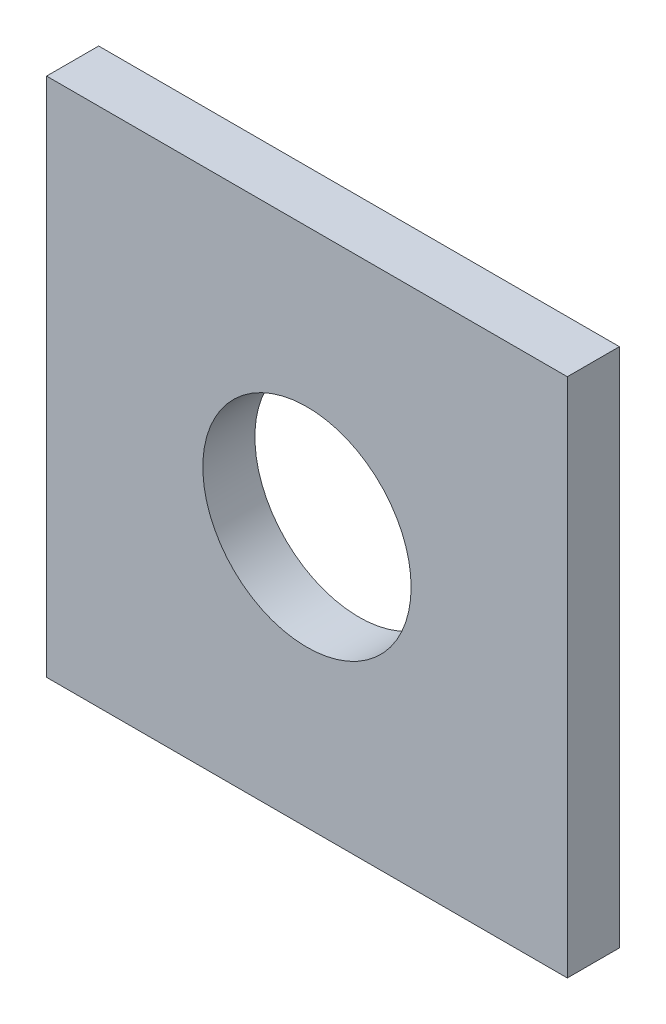
ISO-10303-21;
HEADER;
FILE_DESCRIPTION(('STEP AP214'),'2;1');
FILE_NAME('part.step','',(''),(''),'','','');
FILE_SCHEMA(('AUTOMOTIVE_DESIGN { 1 0 10303 214 1 1 1 1 }'));
ENDSEC;
DATA;
#1=APPLICATION_CONTEXT('core data for automotive mechanical design processes');
#2=APPLICATION_PROTOCOL_DEFINITION('international standard','automotive_design',2000,#1);
#3=PRODUCT_CONTEXT('',#1,'mechanical');
#4=PRODUCT('Part','Part','',(#3));
#5=PRODUCT_RELATED_PRODUCT_CATEGORY('part','',(#4));
#6=PRODUCT_DEFINITION_FORMATION('','',#4);
#7=PRODUCT_DEFINITION_CONTEXT('part definition',#1,'design');
#8=PRODUCT_DEFINITION('design','',#6,#7);
#9=PRODUCT_DEFINITION_SHAPE('','',#8);
#10=(LENGTH_UNIT() NAMED_UNIT(*) SI_UNIT(.MILLI.,.METRE.));
#11=(NAMED_UNIT(*) PLANE_ANGLE_UNIT() SI_UNIT($,.RADIAN.));
#12=(NAMED_UNIT(*) SI_UNIT($,.STERADIAN.) SOLID_ANGLE_UNIT());
#13=UNCERTAINTY_MEASURE_WITH_UNIT(LENGTH_MEASURE(1.E-05),#10,'distance_accuracy_value','');
#14=(GEOMETRIC_REPRESENTATION_CONTEXT(3) GLOBAL_UNCERTAINTY_ASSIGNED_CONTEXT((#13)) GLOBAL_UNIT_ASSIGNED_CONTEXT((#10,
#11,#12)) REPRESENTATION_CONTEXT('',''));
#15=CARTESIAN_POINT('',(0.,0.,0.));
#16=DIRECTION('',(0.,0.,1.));
#17=DIRECTION('',(1.,0.,0.));
#18=AXIS2_PLACEMENT_3D('',#15,#16,#17);
#19=CARTESIAN_POINT('',(-50.,50.,10.));
#20=DIRECTION('',(1.,0.,0.));
#21=DIRECTION('',(0.,1.,0.));
#22=AXIS2_PLACEMENT_3D('',#19,#20,#21);
#23=PLANE('',#22);
#24=DIRECTION('',(0.,-1.,0.));
#25=VECTOR('',#24,1.);
#26=CARTESIAN_POINT('',(-50.,50.,0.));
#27=LINE('',#26,#25);
#28=CARTESIAN_POINT('',(-50.,50.,0.));
#29=VERTEX_POINT('',#28);
#30=CARTESIAN_POINT('',(-50.,-50.,0.));
#31=VERTEX_POINT('',#30);
#32=EDGE_CURVE('E94',#29,#31,#27,.T.);
#33=ORIENTED_EDGE('',*,*,#32,.T.);
#34=DIRECTION('',(0.,0.,-1.));
#35=VECTOR('',#34,1.);
#36=CARTESIAN_POINT('',(-50.,-50.,10.));
#37=LINE('',#36,#35);
#38=CARTESIAN_POINT('',(-50.,-50.,10.));
#39=VERTEX_POINT('',#38);
#40=EDGE_CURVE('E11',#39,#31,#37,.T.);
#41=ORIENTED_EDGE('',*,*,#40,.F.);
#42=DIRECTION('',(0.,-1.,0.));
#43=VECTOR('',#42,1.);
#44=CARTESIAN_POINT('',(-50.,50.,10.));
#45=LINE('',#44,#43);
#46=CARTESIAN_POINT('',(-50.,50.,10.));
#47=VERTEX_POINT('',#46);
#48=EDGE_CURVE('E82',#47,#39,#45,.T.);
#49=ORIENTED_EDGE('',*,*,#48,.F.);
#50=DIRECTION('',(0.,0.,-1.));
#51=VECTOR('',#50,1.);
#52=CARTESIAN_POINT('',(-50.,50.,10.));
#53=LINE('',#52,#51);
#54=EDGE_CURVE('E90',#47,#29,#53,.T.);
#55=ORIENTED_EDGE('',*,*,#54,.T.);
#56=EDGE_LOOP('',(#33,#41,#49,#55));
#57=FACE_BOUND('',#56,.T.);
#58=ADVANCED_FACE('F31',(#57),#23,.F.);
#59=CARTESIAN_POINT('',(-50.,-50.,10.));
#60=DIRECTION('',(0.,1.,0.));
#61=DIRECTION('',(0.,0.,1.));
#62=AXIS2_PLACEMENT_3D('',#59,#60,#61);
#63=PLANE('',#62);
#64=DIRECTION('',(1.,0.,0.));
#65=VECTOR('',#64,1.);
#66=CARTESIAN_POINT('',(-50.,-50.,0.));
#67=LINE('',#66,#65);
#68=CARTESIAN_POINT('',(50.,-50.,0.));
#69=VERTEX_POINT('',#68);
#70=EDGE_CURVE('E86',#31,#69,#67,.T.);
#71=ORIENTED_EDGE('',*,*,#70,.T.);
#72=DIRECTION('',(0.,0.,-1.));
#73=VECTOR('',#72,1.);
#74=CARTESIAN_POINT('',(50.,-50.,10.));
#75=LINE('',#74,#73);
#76=CARTESIAN_POINT('',(50.,-50.,10.));
#77=VERTEX_POINT('',#76);
#78=EDGE_CURVE('E39',#77,#69,#75,.T.);
#79=ORIENTED_EDGE('',*,*,#78,.F.);
#80=DIRECTION('',(1.,0.,0.));
#81=VECTOR('',#80,1.);
#82=CARTESIAN_POINT('',(-50.,-50.,10.));
#83=LINE('',#82,#81);
#84=EDGE_CURVE('E77',#39,#77,#83,.T.);
#85=ORIENTED_EDGE('',*,*,#84,.F.);
#86=ORIENTED_EDGE('',*,*,#40,.T.);
#87=EDGE_LOOP('',(#71,#79,#85,#86));
#88=FACE_BOUND('',#87,.T.);
#89=ADVANCED_FACE('F85',(#88),#63,.F.);
#90=CARTESIAN_POINT('',(50.,50.,10.));
#91=DIRECTION('',(-1.,0.,0.));
#92=DIRECTION('',(0.,-1.,0.));
#93=AXIS2_PLACEMENT_3D('',#90,#91,#92);
#94=PLANE('',#93);
#95=DIRECTION('',(0.,1.,0.));
#96=VECTOR('',#95,1.);
#97=CARTESIAN_POINT('',(50.,50.,0.));
#98=LINE('',#97,#96);
#99=CARTESIAN_POINT('',(50.,50.,0.));
#100=VERTEX_POINT('',#99);
#101=EDGE_CURVE('E64',#69,#100,#98,.T.);
#102=ORIENTED_EDGE('',*,*,#101,.T.);
#103=DIRECTION('',(0.,0.,-1.));
#104=VECTOR('',#103,1.);
#105=CARTESIAN_POINT('',(50.,50.,10.));
#106=LINE('',#105,#104);
#107=CARTESIAN_POINT('',(50.,50.,10.));
#108=VERTEX_POINT('',#107);
#109=EDGE_CURVE('E87',#108,#100,#106,.T.);
#110=ORIENTED_EDGE('',*,*,#109,.F.);
#111=DIRECTION('',(0.,1.,0.));
#112=VECTOR('',#111,1.);
#113=CARTESIAN_POINT('',(50.,50.,10.));
#114=LINE('',#113,#112);
#115=EDGE_CURVE('E80',#77,#108,#114,.T.);
#116=ORIENTED_EDGE('',*,*,#115,.F.);
#117=ORIENTED_EDGE('',*,*,#78,.T.);
#118=EDGE_LOOP('',(#102,#110,#116,#117));
#119=FACE_BOUND('',#118,.T.);
#120=ADVANCED_FACE('F88',(#119),#94,.F.);
#121=CARTESIAN_POINT('',(-50.,50.,10.));
#122=DIRECTION('',(0.,-1.,0.));
#123=DIRECTION('',(0.,0.,-1.));
#124=AXIS2_PLACEMENT_3D('',#121,#122,#123);
#125=PLANE('',#124);
#126=DIRECTION('',(-1.,0.,0.));
#127=VECTOR('',#126,1.);
#128=CARTESIAN_POINT('',(-50.,50.,0.));
#129=LINE('',#128,#127);
#130=EDGE_CURVE('E70',#100,#29,#129,.T.);
#131=ORIENTED_EDGE('',*,*,#130,.T.);
#132=ORIENTED_EDGE('',*,*,#54,.F.);
#133=DIRECTION('',(-1.,0.,0.));
#134=VECTOR('',#133,1.);
#135=CARTESIAN_POINT('',(-50.,50.,10.));
#136=LINE('',#135,#134);
#137=EDGE_CURVE('E47',#108,#47,#136,.T.);
#138=ORIENTED_EDGE('',*,*,#137,.F.);
#139=ORIENTED_EDGE('',*,*,#109,.T.);
#140=EDGE_LOOP('',(#131,#132,#138,#139));
#141=FACE_BOUND('',#140,.T.);
#142=ADVANCED_FACE('F102',(#141),#125,.F.);
#143=CARTESIAN_POINT('',(-50.,-50.,10.));
#144=DIRECTION('',(0.,0.,1.));
#145=DIRECTION('',(1.,0.,0.));
#146=AXIS2_PLACEMENT_3D('',#143,#144,#145);
#147=PLANE('',#146);
#148=CARTESIAN_POINT('',(0.,0.,10.));
#149=DIRECTION('',(0.,0.,1.));
#150=DIRECTION('',(1.,0.,0.));
#151=AXIS2_PLACEMENT_3D('',#148,#149,#150);
#152=CIRCLE('',#151,20.);
#153=CARTESIAN_POINT('',(20.,0.,10.));
#154=VERTEX_POINT('',#153);
#155=EDGE_CURVE('E110',#154,#154,#152,.T.);
#156=ORIENTED_EDGE('',*,*,#155,.F.);
#157=EDGE_LOOP('',(#156));
#158=FACE_BOUND('',#157,.T.);
#159=ORIENTED_EDGE('',*,*,#48,.T.);
#160=ORIENTED_EDGE('',*,*,#84,.T.);
#161=ORIENTED_EDGE('',*,*,#115,.T.);
#162=ORIENTED_EDGE('',*,*,#137,.T.);
#163=EDGE_LOOP('',(#159,#160,#161,#162));
#164=FACE_BOUND('',#163,.T.);
#165=ADVANCED_FACE('F78',(#158,#164),#147,.T.);
#166=CARTESIAN_POINT('',(-50.,-50.,0.));
#167=DIRECTION('',(0.,0.,1.));
#168=DIRECTION('',(1.,0.,0.));
#169=AXIS2_PLACEMENT_3D('',#166,#167,#168);
#170=PLANE('',#169);
#171=CARTESIAN_POINT('',(0.,0.,0.));
#172=DIRECTION('',(0.,0.,1.));
#173=DIRECTION('',(1.,0.,0.));
#174=AXIS2_PLACEMENT_3D('',#171,#172,#173);
#175=CIRCLE('',#174,20.);
#176=CARTESIAN_POINT('',(20.,0.,0.));
#177=VERTEX_POINT('',#176);
#178=EDGE_CURVE('E97',#177,#177,#175,.F.);
#179=ORIENTED_EDGE('',*,*,#178,.F.);
#180=EDGE_LOOP('',(#179));
#181=FACE_BOUND('',#180,.T.);
#182=ORIENTED_EDGE('',*,*,#32,.F.);
#183=ORIENTED_EDGE('',*,*,#130,.F.);
#184=ORIENTED_EDGE('',*,*,#101,.F.);
#185=ORIENTED_EDGE('',*,*,#70,.F.);
#186=EDGE_LOOP('',(#182,#183,#184,#185));
#187=FACE_BOUND('',#186,.T.);
#188=ADVANCED_FACE('F105',(#181,#187),#170,.F.);
#189=CARTESIAN_POINT('',(0.,0.,-0.000999999999999265));
#190=DIRECTION('',(0.,0.,1.));
#191=DIRECTION('',(1.,0.,0.));
#192=AXIS2_PLACEMENT_3D('',#189,#190,#191);
#193=CYLINDRICAL_SURFACE('',#192,20.);
#194=ORIENTED_EDGE('',*,*,#155,.T.);
#195=EDGE_LOOP('',(#194));
#196=FACE_BOUND('',#195,.T.);
#197=ORIENTED_EDGE('',*,*,#178,.T.);
#198=EDGE_LOOP('',(#197));
#199=FACE_BOUND('',#198,.T.);
#200=ADVANCED_FACE('F114',(#196,#199),#193,.F.);
#201=CLOSED_SHELL('',(#58,#89,#120,#142,#165,#188,#200));
#202=MANIFOLD_SOLID_BREP('B2',#201);
#203=ADVANCED_BREP_SHAPE_REPRESENTATION('',(#18,#202),#14);
#204=SHAPE_DEFINITION_REPRESENTATION(#9,#203);
ENDSEC;
END-ISO-10303-21;
